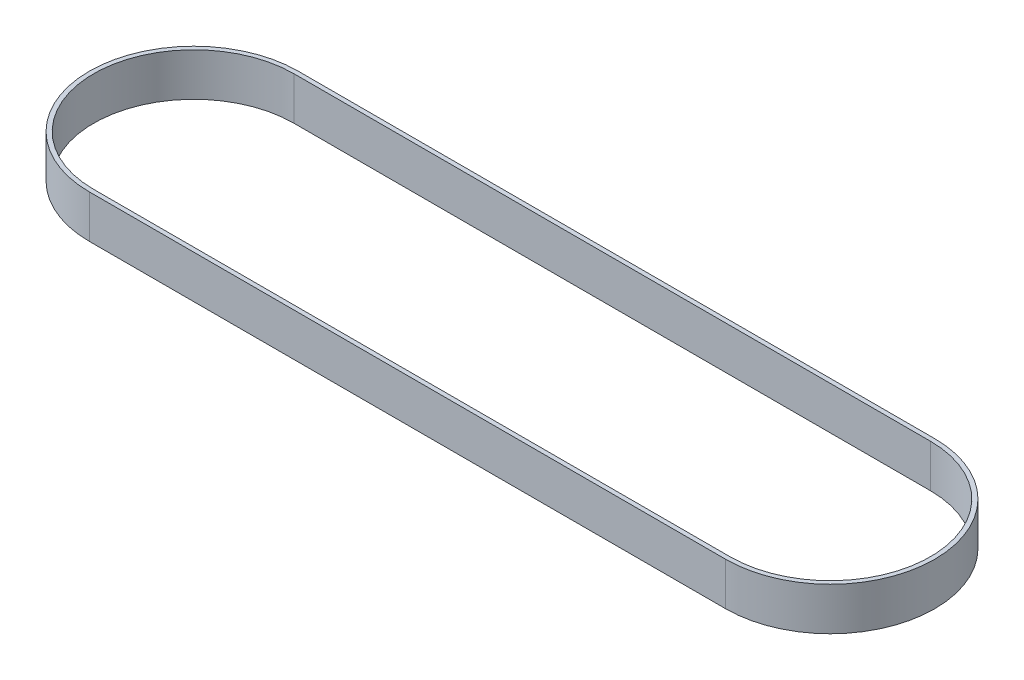
ISO-10303-21;
HEADER;
FILE_DESCRIPTION(('STEP AP214'),'2;1');
FILE_NAME('part.step','',(''),(''),'','','');
FILE_SCHEMA(('AUTOMOTIVE_DESIGN { 1 0 10303 214 1 1 1 1 }'));
ENDSEC;
DATA;
#1=APPLICATION_CONTEXT('core data for automotive mechanical design processes');
#2=APPLICATION_PROTOCOL_DEFINITION('international standard','automotive_design',2000,#1);
#3=PRODUCT_CONTEXT('',#1,'mechanical');
#4=PRODUCT('Part','Part','',(#3));
#5=PRODUCT_RELATED_PRODUCT_CATEGORY('part','',(#4));
#6=PRODUCT_DEFINITION_FORMATION('','',#4);
#7=PRODUCT_DEFINITION_CONTEXT('part definition',#1,'design');
#8=PRODUCT_DEFINITION('design','',#6,#7);
#9=PRODUCT_DEFINITION_SHAPE('','',#8);
#10=(LENGTH_UNIT() NAMED_UNIT(*) SI_UNIT(.MILLI.,.METRE.));
#11=(NAMED_UNIT(*) PLANE_ANGLE_UNIT() SI_UNIT($,.RADIAN.));
#12=(NAMED_UNIT(*) SI_UNIT($,.STERADIAN.) SOLID_ANGLE_UNIT());
#13=UNCERTAINTY_MEASURE_WITH_UNIT(LENGTH_MEASURE(1.E-05),#10,'distance_accuracy_value','');
#14=(GEOMETRIC_REPRESENTATION_CONTEXT(3) GLOBAL_UNCERTAINTY_ASSIGNED_CONTEXT((#13)) GLOBAL_UNIT_ASSIGNED_CONTEXT((#10,
#11,#12)) REPRESENTATION_CONTEXT('',''));
#15=CARTESIAN_POINT('',(0.,0.,0.));
#16=DIRECTION('',(0.,0.,1.));
#17=DIRECTION('',(1.,0.,0.));
#18=AXIS2_PLACEMENT_3D('',#15,#16,#17);
#19=CARTESIAN_POINT('',(0.,15.,0.));
#20=DIRECTION('',(0.,1.,0.));
#21=DIRECTION('',(0.,0.,1.));
#22=AXIS2_PLACEMENT_3D('',#19,#20,#21);
#23=PLANE('',#22);
#24=CARTESIAN_POINT('',(0.,15.,0.));
#25=DIRECTION('',(0.,1.,0.));
#26=DIRECTION('',(0.,0.,1.));
#27=AXIS2_PLACEMENT_3D('',#24,#25,#26);
#28=CIRCLE('',#27,36.5379);
#29=CARTESIAN_POINT('',(0.,15.,-36.5379));
#30=VERTEX_POINT('',#29);
#31=CARTESIAN_POINT('',(0.,15.,36.5379));
#32=VERTEX_POINT('',#31);
#33=EDGE_CURVE('E153',#30,#32,#28,.T.);
#34=ORIENTED_EDGE('',*,*,#33,.T.);
#35=DIRECTION('',(1.,0.,0.));
#36=VECTOR('',#35,1.);
#37=CARTESIAN_POINT('',(0.,15.,36.5379));
#38=LINE('',#37,#36);
#39=CARTESIAN_POINT('',(222.5548,15.,36.5379));
#40=VERTEX_POINT('',#39);
#41=EDGE_CURVE('E157',#32,#40,#38,.T.);
#42=ORIENTED_EDGE('',*,*,#41,.T.);
#43=CARTESIAN_POINT('',(222.5548,15.,0.));
#44=DIRECTION('',(0.,1.,0.));
#45=DIRECTION('',(0.,0.,1.));
#46=AXIS2_PLACEMENT_3D('',#43,#44,#45);
#47=CIRCLE('',#46,36.5379);
#48=CARTESIAN_POINT('',(222.5548,15.,-36.5379));
#49=VERTEX_POINT('',#48);
#50=EDGE_CURVE('E161',#40,#49,#47,.T.);
#51=ORIENTED_EDGE('',*,*,#50,.T.);
#52=DIRECTION('',(-1.,0.,0.));
#53=VECTOR('',#52,1.);
#54=CARTESIAN_POINT('',(0.,15.,-36.5379));
#55=LINE('',#54,#53);
#56=EDGE_CURVE('E164',#49,#30,#55,.T.);
#57=ORIENTED_EDGE('',*,*,#56,.T.);
#58=EDGE_LOOP('',(#34,#42,#51,#57));
#59=FACE_BOUND('',#58,.T.);
#60=DIRECTION('',(1.,0.,0.));
#61=VECTOR('',#60,1.);
#62=CARTESIAN_POINT('',(0.,15.,35.0139));
#63=LINE('',#62,#61);
#64=CARTESIAN_POINT('',(0.,15.,35.0139));
#65=VERTEX_POINT('',#64);
#66=CARTESIAN_POINT('',(222.5548,15.,35.0139));
#67=VERTEX_POINT('',#66);
#68=EDGE_CURVE('E114',#65,#67,#63,.T.);
#69=ORIENTED_EDGE('',*,*,#68,.F.);
#70=CARTESIAN_POINT('',(0.,15.,0.));
#71=DIRECTION('',(0.,1.,0.));
#72=DIRECTION('',(0.,0.,1.));
#73=AXIS2_PLACEMENT_3D('',#70,#71,#72);
#74=CIRCLE('',#73,35.0139);
#75=CARTESIAN_POINT('',(0.,15.,-35.0139));
#76=VERTEX_POINT('',#75);
#77=EDGE_CURVE('E105',#76,#65,#74,.T.);
#78=ORIENTED_EDGE('',*,*,#77,.F.);
#79=DIRECTION('',(-1.,0.,0.));
#80=VECTOR('',#79,1.);
#81=CARTESIAN_POINT('',(0.,15.,-35.0139));
#82=LINE('',#81,#80);
#83=CARTESIAN_POINT('',(222.5548,15.,-35.0139));
#84=VERTEX_POINT('',#83);
#85=EDGE_CURVE('E131',#84,#76,#82,.T.);
#86=ORIENTED_EDGE('',*,*,#85,.F.);
#87=CARTESIAN_POINT('',(222.5548,15.,0.));
#88=DIRECTION('',(0.,1.,0.));
#89=DIRECTION('',(0.,0.,1.));
#90=AXIS2_PLACEMENT_3D('',#87,#88,#89);
#91=CIRCLE('',#90,35.0139);
#92=EDGE_CURVE('E127',#67,#84,#91,.T.);
#93=ORIENTED_EDGE('',*,*,#92,.F.);
#94=EDGE_LOOP('',(#69,#78,#86,#93));
#95=FACE_BOUND('',#94,.T.);
#96=ADVANCED_FACE('F39',(#59,#95),#23,.T.);
#97=CARTESIAN_POINT('',(0.,0.,0.));
#98=DIRECTION('',(0.,1.,0.));
#99=DIRECTION('',(0.,0.,1.));
#100=AXIS2_PLACEMENT_3D('',#97,#98,#99);
#101=PLANE('',#100);
#102=CARTESIAN_POINT('',(0.,0.,0.));
#103=DIRECTION('',(0.,1.,0.));
#104=DIRECTION('',(0.,0.,1.));
#105=AXIS2_PLACEMENT_3D('',#102,#103,#104);
#106=CIRCLE('',#105,36.5379);
#107=CARTESIAN_POINT('',(0.,0.,-36.5379));
#108=VERTEX_POINT('',#107);
#109=CARTESIAN_POINT('',(0.,0.,36.5379));
#110=VERTEX_POINT('',#109);
#111=EDGE_CURVE('E123',#108,#110,#106,.T.);
#112=ORIENTED_EDGE('',*,*,#111,.F.);
#113=DIRECTION('',(-1.,0.,0.));
#114=VECTOR('',#113,1.);
#115=CARTESIAN_POINT('',(0.,0.,-36.5379));
#116=LINE('',#115,#114);
#117=CARTESIAN_POINT('',(222.5548,0.,-36.5379));
#118=VERTEX_POINT('',#117);
#119=EDGE_CURVE('E158',#118,#108,#116,.T.);
#120=ORIENTED_EDGE('',*,*,#119,.F.);
#121=CARTESIAN_POINT('',(222.5548,0.,0.));
#122=DIRECTION('',(0.,1.,0.));
#123=DIRECTION('',(0.,0.,1.));
#124=AXIS2_PLACEMENT_3D('',#121,#122,#123);
#125=CIRCLE('',#124,36.5379);
#126=CARTESIAN_POINT('',(222.5548,0.,36.5379));
#127=VERTEX_POINT('',#126);
#128=EDGE_CURVE('E174',#127,#118,#125,.T.);
#129=ORIENTED_EDGE('',*,*,#128,.F.);
#130=DIRECTION('',(1.,0.,0.));
#131=VECTOR('',#130,1.);
#132=CARTESIAN_POINT('',(0.,0.,36.5379));
#133=LINE('',#132,#131);
#134=EDGE_CURVE('E171',#110,#127,#133,.T.);
#135=ORIENTED_EDGE('',*,*,#134,.F.);
#136=EDGE_LOOP('',(#112,#120,#129,#135));
#137=FACE_BOUND('',#136,.T.);
#138=CARTESIAN_POINT('',(0.,0.,0.));
#139=DIRECTION('',(0.,1.,0.));
#140=DIRECTION('',(0.,0.,1.));
#141=AXIS2_PLACEMENT_3D('',#138,#139,#140);
#142=CIRCLE('',#141,35.0139);
#143=CARTESIAN_POINT('',(0.,0.,-35.0139));
#144=VERTEX_POINT('',#143);
#145=CARTESIAN_POINT('',(0.,0.,35.0139));
#146=VERTEX_POINT('',#145);
#147=EDGE_CURVE('E63',#144,#146,#142,.T.);
#148=ORIENTED_EDGE('',*,*,#147,.T.);
#149=DIRECTION('',(1.,0.,0.));
#150=VECTOR('',#149,1.);
#151=CARTESIAN_POINT('',(0.,0.,35.0139));
#152=LINE('',#151,#150);
#153=CARTESIAN_POINT('',(222.5548,0.,35.0139));
#154=VERTEX_POINT('',#153);
#155=EDGE_CURVE('E121',#146,#154,#152,.T.);
#156=ORIENTED_EDGE('',*,*,#155,.T.);
#157=CARTESIAN_POINT('',(222.5548,0.,0.));
#158=DIRECTION('',(0.,1.,0.));
#159=DIRECTION('',(0.,0.,1.));
#160=AXIS2_PLACEMENT_3D('',#157,#158,#159);
#161=CIRCLE('',#160,35.0139);
#162=CARTESIAN_POINT('',(222.5548,0.,-35.0139));
#163=VERTEX_POINT('',#162);
#164=EDGE_CURVE('E140',#154,#163,#161,.T.);
#165=ORIENTED_EDGE('',*,*,#164,.T.);
#166=DIRECTION('',(-1.,0.,0.));
#167=VECTOR('',#166,1.);
#168=CARTESIAN_POINT('',(0.,0.,-35.0139));
#169=LINE('',#168,#167);
#170=EDGE_CURVE('E115',#163,#144,#169,.T.);
#171=ORIENTED_EDGE('',*,*,#170,.T.);
#172=EDGE_LOOP('',(#148,#156,#165,#171));
#173=FACE_BOUND('',#172,.T.);
#174=ADVANCED_FACE('F197',(#137,#173),#101,.F.);
#175=CARTESIAN_POINT('',(0.,15.,0.));
#176=DIRECTION('',(0.,-1.,0.));
#177=DIRECTION('',(0.,0.,-1.));
#178=AXIS2_PLACEMENT_3D('',#175,#176,#177);
#179=CYLINDRICAL_SURFACE('',#178,36.5379);
#180=ORIENTED_EDGE('',*,*,#111,.T.);
#181=DIRECTION('',(0.,-1.,0.));
#182=VECTOR('',#181,1.);
#183=CARTESIAN_POINT('',(0.,15.,36.5379));
#184=LINE('',#183,#182);
#185=EDGE_CURVE('E11',#32,#110,#184,.T.);
#186=ORIENTED_EDGE('',*,*,#185,.F.);
#187=ORIENTED_EDGE('',*,*,#33,.F.);
#188=DIRECTION('',(0.,-1.,0.));
#189=VECTOR('',#188,1.);
#190=CARTESIAN_POINT('',(0.,15.,-36.5379));
#191=LINE('',#190,#189);
#192=EDGE_CURVE('E167',#30,#108,#191,.T.);
#193=ORIENTED_EDGE('',*,*,#192,.T.);
#194=EDGE_LOOP('',(#180,#186,#187,#193));
#195=FACE_BOUND('',#194,.T.);
#196=ADVANCED_FACE('F41',(#195),#179,.T.);
#197=CARTESIAN_POINT('',(0.,15.,36.5379));
#198=DIRECTION('',(0.,0.,-1.));
#199=DIRECTION('',(-1.,0.,0.));
#200=AXIS2_PLACEMENT_3D('',#197,#198,#199);
#201=PLANE('',#200);
#202=ORIENTED_EDGE('',*,*,#134,.T.);
#203=DIRECTION('',(0.,-1.,0.));
#204=VECTOR('',#203,1.);
#205=CARTESIAN_POINT('',(222.5548,15.,36.5379));
#206=LINE('',#205,#204);
#207=EDGE_CURVE('E48',#40,#127,#206,.T.);
#208=ORIENTED_EDGE('',*,*,#207,.F.);
#209=ORIENTED_EDGE('',*,*,#41,.F.);
#210=ORIENTED_EDGE('',*,*,#185,.T.);
#211=EDGE_LOOP('',(#202,#208,#209,#210));
#212=FACE_BOUND('',#211,.T.);
#213=ADVANCED_FACE('F207',(#212),#201,.F.);
#214=CARTESIAN_POINT('',(222.5548,15.,0.));
#215=DIRECTION('',(0.,-1.,0.));
#216=DIRECTION('',(0.,0.,-1.));
#217=AXIS2_PLACEMENT_3D('',#214,#215,#216);
#218=CYLINDRICAL_SURFACE('',#217,36.5379);
#219=ORIENTED_EDGE('',*,*,#128,.T.);
#220=DIRECTION('',(0.,-1.,0.));
#221=VECTOR('',#220,1.);
#222=CARTESIAN_POINT('',(222.5548,15.,-36.5379));
#223=LINE('',#222,#221);
#224=EDGE_CURVE('E182',#49,#118,#223,.T.);
#225=ORIENTED_EDGE('',*,*,#224,.F.);
#226=ORIENTED_EDGE('',*,*,#50,.F.);
#227=ORIENTED_EDGE('',*,*,#207,.T.);
#228=EDGE_LOOP('',(#219,#225,#226,#227));
#229=FACE_BOUND('',#228,.T.);
#230=ADVANCED_FACE('F191',(#229),#218,.T.);
#231=CARTESIAN_POINT('',(0.,15.,-36.5379));
#232=DIRECTION('',(0.,0.,1.));
#233=DIRECTION('',(1.,0.,0.));
#234=AXIS2_PLACEMENT_3D('',#231,#232,#233);
#235=PLANE('',#234);
#236=ORIENTED_EDGE('',*,*,#119,.T.);
#237=ORIENTED_EDGE('',*,*,#192,.F.);
#238=ORIENTED_EDGE('',*,*,#56,.F.);
#239=ORIENTED_EDGE('',*,*,#224,.T.);
#240=EDGE_LOOP('',(#236,#237,#238,#239));
#241=FACE_BOUND('',#240,.T.);
#242=ADVANCED_FACE('F201',(#241),#235,.F.);
#243=CARTESIAN_POINT('',(0.,15.,0.));
#244=DIRECTION('',(0.,-1.,0.));
#245=DIRECTION('',(0.,0.,-1.));
#246=AXIS2_PLACEMENT_3D('',#243,#244,#245);
#247=CYLINDRICAL_SURFACE('',#246,35.0139);
#248=ORIENTED_EDGE('',*,*,#147,.F.);
#249=DIRECTION('',(0.,-1.,0.));
#250=VECTOR('',#249,1.);
#251=CARTESIAN_POINT('',(0.,15.,-35.0139));
#252=LINE('',#251,#250);
#253=EDGE_CURVE('E109',#76,#144,#252,.T.);
#254=ORIENTED_EDGE('',*,*,#253,.F.);
#255=ORIENTED_EDGE('',*,*,#77,.T.);
#256=DIRECTION('',(0.,-1.,0.));
#257=VECTOR('',#256,1.);
#258=CARTESIAN_POINT('',(0.,15.,35.0139));
#259=LINE('',#258,#257);
#260=EDGE_CURVE('E108',#65,#146,#259,.T.);
#261=ORIENTED_EDGE('',*,*,#260,.T.);
#262=EDGE_LOOP('',(#248,#254,#255,#261));
#263=FACE_BOUND('',#262,.T.);
#264=ADVANCED_FACE('F107',(#263),#247,.F.);
#265=CARTESIAN_POINT('',(0.,15.,35.0139));
#266=DIRECTION('',(0.,0.,-1.));
#267=DIRECTION('',(-1.,0.,0.));
#268=AXIS2_PLACEMENT_3D('',#265,#266,#267);
#269=PLANE('',#268);
#270=ORIENTED_EDGE('',*,*,#155,.F.);
#271=ORIENTED_EDGE('',*,*,#260,.F.);
#272=ORIENTED_EDGE('',*,*,#68,.T.);
#273=DIRECTION('',(0.,-1.,0.));
#274=VECTOR('',#273,1.);
#275=CARTESIAN_POINT('',(222.5548,15.,35.0139));
#276=LINE('',#275,#274);
#277=EDGE_CURVE('E124',#67,#154,#276,.T.);
#278=ORIENTED_EDGE('',*,*,#277,.T.);
#279=EDGE_LOOP('',(#270,#271,#272,#278));
#280=FACE_BOUND('',#279,.T.);
#281=ADVANCED_FACE('F118',(#280),#269,.T.);
#282=CARTESIAN_POINT('',(222.5548,15.,0.));
#283=DIRECTION('',(0.,-1.,0.));
#284=DIRECTION('',(0.,0.,-1.));
#285=AXIS2_PLACEMENT_3D('',#282,#283,#284);
#286=CYLINDRICAL_SURFACE('',#285,35.0139);
#287=ORIENTED_EDGE('',*,*,#164,.F.);
#288=ORIENTED_EDGE('',*,*,#277,.F.);
#289=ORIENTED_EDGE('',*,*,#92,.T.);
#290=DIRECTION('',(0.,-1.,0.));
#291=VECTOR('',#290,1.);
#292=CARTESIAN_POINT('',(222.5548,15.,-35.0139));
#293=LINE('',#292,#291);
#294=EDGE_CURVE('E55',#84,#163,#293,.T.);
#295=ORIENTED_EDGE('',*,*,#294,.T.);
#296=EDGE_LOOP('',(#287,#288,#289,#295));
#297=FACE_BOUND('',#296,.T.);
#298=ADVANCED_FACE('F230',(#297),#286,.F.);
#299=CARTESIAN_POINT('',(0.,15.,-35.0139));
#300=DIRECTION('',(0.,0.,1.));
#301=DIRECTION('',(1.,0.,0.));
#302=AXIS2_PLACEMENT_3D('',#299,#300,#301);
#303=PLANE('',#302);
#304=ORIENTED_EDGE('',*,*,#170,.F.);
#305=ORIENTED_EDGE('',*,*,#294,.F.);
#306=ORIENTED_EDGE('',*,*,#85,.T.);
#307=ORIENTED_EDGE('',*,*,#253,.T.);
#308=EDGE_LOOP('',(#304,#305,#306,#307));
#309=FACE_BOUND('',#308,.T.);
#310=ADVANCED_FACE('F234',(#309),#303,.T.);
#311=CLOSED_SHELL('',(#96,#174,#196,#213,#230,#242,#264,#281,#298,#310));
#312=MANIFOLD_SOLID_BREP('B2',#311);
#313=ADVANCED_BREP_SHAPE_REPRESENTATION('',(#18,#312),#14);
#314=SHAPE_DEFINITION_REPRESENTATION(#9,#313);
ENDSEC;
END-ISO-10303-21;
